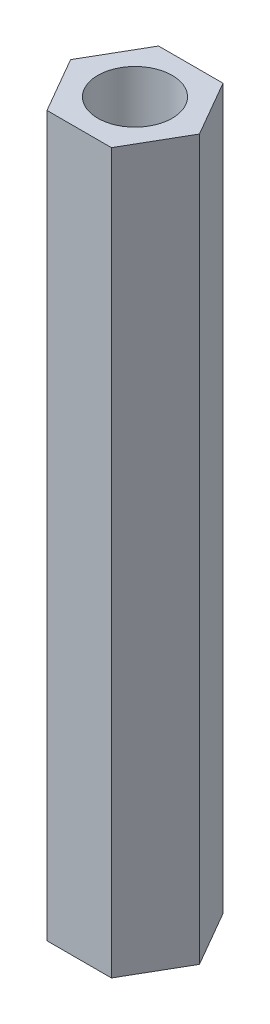
ISO-10303-21;
HEADER;
FILE_DESCRIPTION(('STEP AP214'),'2;1');
FILE_NAME('part.step','',(''),(''),'','','');
FILE_SCHEMA(('AUTOMOTIVE_DESIGN { 1 0 10303 214 1 1 1 1 }'));
ENDSEC;
DATA;
#1=APPLICATION_CONTEXT('core data for automotive mechanical design processes');
#2=APPLICATION_PROTOCOL_DEFINITION('international standard','automotive_design',2000,#1);
#3=PRODUCT_CONTEXT('',#1,'mechanical');
#4=PRODUCT('Part','Part','',(#3));
#5=PRODUCT_RELATED_PRODUCT_CATEGORY('part','',(#4));
#6=PRODUCT_DEFINITION_FORMATION('','',#4);
#7=PRODUCT_DEFINITION_CONTEXT('part definition',#1,'design');
#8=PRODUCT_DEFINITION('design','',#6,#7);
#9=PRODUCT_DEFINITION_SHAPE('','',#8);
#10=(LENGTH_UNIT() NAMED_UNIT(*) SI_UNIT(.MILLI.,.METRE.));
#11=(NAMED_UNIT(*) PLANE_ANGLE_UNIT() SI_UNIT($,.RADIAN.));
#12=(NAMED_UNIT(*) SI_UNIT($,.STERADIAN.) SOLID_ANGLE_UNIT());
#13=UNCERTAINTY_MEASURE_WITH_UNIT(LENGTH_MEASURE(1.E-05),#10,'distance_accuracy_value','');
#14=(GEOMETRIC_REPRESENTATION_CONTEXT(3) GLOBAL_UNCERTAINTY_ASSIGNED_CONTEXT((#13)) GLOBAL_UNIT_ASSIGNED_CONTEXT((#10,
#11,#12)) REPRESENTATION_CONTEXT('',''));
#15=CARTESIAN_POINT('',(0.,0.,0.));
#16=DIRECTION('',(0.,0.,1.));
#17=DIRECTION('',(1.,0.,0.));
#18=AXIS2_PLACEMENT_3D('',#15,#16,#17);
#19=CARTESIAN_POINT('',(0.,58.,0.));
#20=DIRECTION('',(0.,1.,0.));
#21=DIRECTION('',(0.,0.,1.));
#22=AXIS2_PLACEMENT_3D('',#19,#20,#21);
#23=PLANE('',#22);
#24=DIRECTION('',(0.5,0.,-0.866025403784439));
#25=VECTOR('',#24,1.);
#26=CARTESIAN_POINT('',(2.59807621135332,58.,4.5));
#27=LINE('',#26,#25);
#28=CARTESIAN_POINT('',(2.59807621135332,58.,4.5));
#29=VERTEX_POINT('',#28);
#30=CARTESIAN_POINT('',(5.19615242270663,58.,0.));
#31=VERTEX_POINT('',#30);
#32=EDGE_CURVE('E131',#29,#31,#27,.T.);
#33=ORIENTED_EDGE('',*,*,#32,.T.);
#34=DIRECTION('',(-0.5,0.,-0.866025403784439));
#35=VECTOR('',#34,1.);
#36=CARTESIAN_POINT('',(5.19615242270663,58.,0.));
#37=LINE('',#36,#35);
#38=CARTESIAN_POINT('',(2.59807621135331,58.,-4.5));
#39=VERTEX_POINT('',#38);
#40=EDGE_CURVE('E89',#31,#39,#37,.T.);
#41=ORIENTED_EDGE('',*,*,#40,.T.);
#42=DIRECTION('',(-1.,0.,0.));
#43=VECTOR('',#42,1.);
#44=CARTESIAN_POINT('',(2.59807621135331,58.,-4.5));
#45=LINE('',#44,#43);
#46=CARTESIAN_POINT('',(-2.59807621135332,58.,-4.5));
#47=VERTEX_POINT('',#46);
#48=EDGE_CURVE('E102',#39,#47,#45,.T.);
#49=ORIENTED_EDGE('',*,*,#48,.T.);
#50=DIRECTION('',(-0.5,0.,0.866025403784439));
#51=VECTOR('',#50,1.);
#52=CARTESIAN_POINT('',(-2.59807621135332,58.,-4.5));
#53=LINE('',#52,#51);
#54=CARTESIAN_POINT('',(-5.19615242270663,58.,0.));
#55=VERTEX_POINT('',#54);
#56=EDGE_CURVE('E96',#47,#55,#53,.T.);
#57=ORIENTED_EDGE('',*,*,#56,.T.);
#58=DIRECTION('',(0.5,0.,0.866025403784439));
#59=VECTOR('',#58,1.);
#60=CARTESIAN_POINT('',(-5.19615242270663,58.,0.));
#61=LINE('',#60,#59);
#62=CARTESIAN_POINT('',(-2.59807621135332,58.,4.5));
#63=VERTEX_POINT('',#62);
#64=EDGE_CURVE('E100',#55,#63,#61,.T.);
#65=ORIENTED_EDGE('',*,*,#64,.T.);
#66=DIRECTION('',(1.,0.,0.));
#67=VECTOR('',#66,1.);
#68=CARTESIAN_POINT('',(-2.59807621135332,58.,4.5));
#69=LINE('',#68,#67);
#70=EDGE_CURVE('E52',#63,#29,#69,.T.);
#71=ORIENTED_EDGE('',*,*,#70,.T.);
#72=EDGE_LOOP('',(#33,#41,#49,#57,#65,#71));
#73=FACE_BOUND('',#72,.T.);
#74=CARTESIAN_POINT('',(0.,58.,0.));
#75=DIRECTION('',(0.,1.,0.));
#76=DIRECTION('',(0.,0.,1.));
#77=AXIS2_PLACEMENT_3D('',#74,#75,#76);
#78=CIRCLE('',#77,3.);
#79=CARTESIAN_POINT('',(0.,58.,-3.));
#80=VERTEX_POINT('',#79);
#81=EDGE_CURVE('E124',#80,#80,#78,.T.);
#82=ORIENTED_EDGE('',*,*,#81,.F.);
#83=EDGE_LOOP('',(#82));
#84=FACE_BOUND('',#83,.T.);
#85=ADVANCED_FACE('F35',(#73,#84),#23,.T.);
#86=CARTESIAN_POINT('',(0.,0.,0.));
#87=DIRECTION('',(0.,1.,0.));
#88=DIRECTION('',(0.,0.,1.));
#89=AXIS2_PLACEMENT_3D('',#86,#87,#88);
#90=PLANE('',#89);
#91=DIRECTION('',(0.5,0.,-0.866025403784439));
#92=VECTOR('',#91,1.);
#93=CARTESIAN_POINT('',(2.59807621135332,0.,4.5));
#94=LINE('',#93,#92);
#95=CARTESIAN_POINT('',(2.59807621135332,0.,4.5));
#96=VERTEX_POINT('',#95);
#97=CARTESIAN_POINT('',(5.19615242270663,0.,0.));
#98=VERTEX_POINT('',#97);
#99=EDGE_CURVE('E120',#96,#98,#94,.T.);
#100=ORIENTED_EDGE('',*,*,#99,.F.);
#101=DIRECTION('',(1.,0.,0.));
#102=VECTOR('',#101,1.);
#103=CARTESIAN_POINT('',(-2.59807621135332,0.,4.5));
#104=LINE('',#103,#102);
#105=CARTESIAN_POINT('',(-2.59807621135332,0.,4.5));
#106=VERTEX_POINT('',#105);
#107=EDGE_CURVE('E81',#106,#96,#104,.T.);
#108=ORIENTED_EDGE('',*,*,#107,.F.);
#109=DIRECTION('',(0.5,0.,0.866025403784439));
#110=VECTOR('',#109,1.);
#111=CARTESIAN_POINT('',(-5.19615242270663,0.,0.));
#112=LINE('',#111,#110);
#113=CARTESIAN_POINT('',(-5.19615242270663,0.,0.));
#114=VERTEX_POINT('',#113);
#115=EDGE_CURVE('E75',#114,#106,#112,.T.);
#116=ORIENTED_EDGE('',*,*,#115,.F.);
#117=DIRECTION('',(-0.5,0.,0.866025403784439));
#118=VECTOR('',#117,1.);
#119=CARTESIAN_POINT('',(-2.59807621135332,0.,-4.5));
#120=LINE('',#119,#118);
#121=CARTESIAN_POINT('',(-2.59807621135332,0.,-4.5));
#122=VERTEX_POINT('',#121);
#123=EDGE_CURVE('E110',#122,#114,#120,.T.);
#124=ORIENTED_EDGE('',*,*,#123,.F.);
#125=DIRECTION('',(-1.,0.,0.));
#126=VECTOR('',#125,1.);
#127=CARTESIAN_POINT('',(2.59807621135331,0.,-4.5));
#128=LINE('',#127,#126);
#129=CARTESIAN_POINT('',(2.59807621135331,0.,-4.5));
#130=VERTEX_POINT('',#129);
#131=EDGE_CURVE('E126',#130,#122,#128,.T.);
#132=ORIENTED_EDGE('',*,*,#131,.F.);
#133=DIRECTION('',(-0.5,0.,-0.866025403784439));
#134=VECTOR('',#133,1.);
#135=CARTESIAN_POINT('',(5.19615242270663,0.,0.));
#136=LINE('',#135,#134);
#137=EDGE_CURVE('E123',#98,#130,#136,.T.);
#138=ORIENTED_EDGE('',*,*,#137,.F.);
#139=EDGE_LOOP('',(#100,#108,#116,#124,#132,#138));
#140=FACE_BOUND('',#139,.T.);
#141=CARTESIAN_POINT('',(0.,0.,0.));
#142=DIRECTION('',(0.,1.,0.));
#143=DIRECTION('',(0.,0.,1.));
#144=AXIS2_PLACEMENT_3D('',#141,#142,#143);
#145=CIRCLE('',#144,3.);
#146=CARTESIAN_POINT('',(0.,0.,-3.));
#147=VERTEX_POINT('',#146);
#148=EDGE_CURVE('E224',#147,#147,#145,.T.);
#149=ORIENTED_EDGE('',*,*,#148,.T.);
#150=EDGE_LOOP('',(#149));
#151=FACE_BOUND('',#150,.T.);
#152=ADVANCED_FACE('F140',(#140,#151),#90,.F.);
#153=CARTESIAN_POINT('',(2.59807621135332,58.,4.5));
#154=DIRECTION('',(-0.866025403784439,0.,-0.5));
#155=DIRECTION('',(-0.5,0.,0.866025403784439));
#156=AXIS2_PLACEMENT_3D('',#153,#154,#155);
#157=PLANE('',#156);
#158=ORIENTED_EDGE('',*,*,#99,.T.);
#159=DIRECTION('',(0.,-1.,0.));
#160=VECTOR('',#159,1.);
#161=CARTESIAN_POINT('',(5.19615242270663,58.,0.));
#162=LINE('',#161,#160);
#163=EDGE_CURVE('E11',#31,#98,#162,.T.);
#164=ORIENTED_EDGE('',*,*,#163,.F.);
#165=ORIENTED_EDGE('',*,*,#32,.F.);
#166=DIRECTION('',(0.,-1.,0.));
#167=VECTOR('',#166,1.);
#168=CARTESIAN_POINT('',(2.59807621135332,58.,4.5));
#169=LINE('',#168,#167);
#170=EDGE_CURVE('E116',#29,#96,#169,.T.);
#171=ORIENTED_EDGE('',*,*,#170,.T.);
#172=EDGE_LOOP('',(#158,#164,#165,#171));
#173=FACE_BOUND('',#172,.T.);
#174=ADVANCED_FACE('F37',(#173),#157,.F.);
#175=CARTESIAN_POINT('',(5.19615242270663,58.,0.));
#176=DIRECTION('',(-0.866025403784438,0.,0.5));
#177=DIRECTION('',(0.5,0.,0.866025403784439));
#178=AXIS2_PLACEMENT_3D('',#175,#176,#177);
#179=PLANE('',#178);
#180=ORIENTED_EDGE('',*,*,#137,.T.);
#181=DIRECTION('',(0.,-1.,0.));
#182=VECTOR('',#181,1.);
#183=CARTESIAN_POINT('',(2.59807621135331,58.,-4.5));
#184=LINE('',#183,#182);
#185=EDGE_CURVE('E44',#39,#130,#184,.T.);
#186=ORIENTED_EDGE('',*,*,#185,.F.);
#187=ORIENTED_EDGE('',*,*,#40,.F.);
#188=ORIENTED_EDGE('',*,*,#163,.T.);
#189=EDGE_LOOP('',(#180,#186,#187,#188));
#190=FACE_BOUND('',#189,.T.);
#191=ADVANCED_FACE('F165',(#190),#179,.F.);
#192=CARTESIAN_POINT('',(2.59807621135331,58.,-4.5));
#193=DIRECTION('',(0.,0.,1.));
#194=DIRECTION('',(1.,0.,0.));
#195=AXIS2_PLACEMENT_3D('',#192,#193,#194);
#196=PLANE('',#195);
#197=ORIENTED_EDGE('',*,*,#131,.T.);
#198=DIRECTION('',(0.,-1.,0.));
#199=VECTOR('',#198,1.);
#200=CARTESIAN_POINT('',(-2.59807621135332,58.,-4.5));
#201=LINE('',#200,#199);
#202=EDGE_CURVE('E111',#47,#122,#201,.T.);
#203=ORIENTED_EDGE('',*,*,#202,.F.);
#204=ORIENTED_EDGE('',*,*,#48,.F.);
#205=ORIENTED_EDGE('',*,*,#185,.T.);
#206=EDGE_LOOP('',(#197,#203,#204,#205));
#207=FACE_BOUND('',#206,.T.);
#208=ADVANCED_FACE('F137',(#207),#196,.F.);
#209=CARTESIAN_POINT('',(-2.59807621135332,58.,-4.5));
#210=DIRECTION('',(0.866025403784439,0.,0.5));
#211=DIRECTION('',(0.5,0.,-0.866025403784439));
#212=AXIS2_PLACEMENT_3D('',#209,#210,#211);
#213=PLANE('',#212);
#214=ORIENTED_EDGE('',*,*,#123,.T.);
#215=DIRECTION('',(0.,-1.,0.));
#216=VECTOR('',#215,1.);
#217=CARTESIAN_POINT('',(-5.19615242270663,58.,0.));
#218=LINE('',#217,#216);
#219=EDGE_CURVE('E107',#55,#114,#218,.T.);
#220=ORIENTED_EDGE('',*,*,#219,.F.);
#221=ORIENTED_EDGE('',*,*,#56,.F.);
#222=ORIENTED_EDGE('',*,*,#202,.T.);
#223=EDGE_LOOP('',(#214,#220,#221,#222));
#224=FACE_BOUND('',#223,.T.);
#225=ADVANCED_FACE('F108',(#224),#213,.F.);
#226=CARTESIAN_POINT('',(-5.19615242270663,58.,0.));
#227=DIRECTION('',(0.866025403784438,0.,-0.5));
#228=DIRECTION('',(-0.5,0.,-0.866025403784439));
#229=AXIS2_PLACEMENT_3D('',#226,#227,#228);
#230=PLANE('',#229);
#231=ORIENTED_EDGE('',*,*,#115,.T.);
#232=DIRECTION('',(0.,-1.,0.));
#233=VECTOR('',#232,1.);
#234=CARTESIAN_POINT('',(-2.59807621135332,58.,4.5));
#235=LINE('',#234,#233);
#236=EDGE_CURVE('E112',#63,#106,#235,.T.);
#237=ORIENTED_EDGE('',*,*,#236,.F.);
#238=ORIENTED_EDGE('',*,*,#64,.F.);
#239=ORIENTED_EDGE('',*,*,#219,.T.);
#240=EDGE_LOOP('',(#231,#237,#238,#239));
#241=FACE_BOUND('',#240,.T.);
#242=ADVANCED_FACE('F114',(#241),#230,.F.);
#243=CARTESIAN_POINT('',(-2.59807621135332,58.,4.5));
#244=DIRECTION('',(0.,0.,-1.));
#245=DIRECTION('',(-1.,0.,0.));
#246=AXIS2_PLACEMENT_3D('',#243,#244,#245);
#247=PLANE('',#246);
#248=ORIENTED_EDGE('',*,*,#107,.T.);
#249=ORIENTED_EDGE('',*,*,#170,.F.);
#250=ORIENTED_EDGE('',*,*,#70,.F.);
#251=ORIENTED_EDGE('',*,*,#236,.T.);
#252=EDGE_LOOP('',(#248,#249,#250,#251));
#253=FACE_BOUND('',#252,.T.);
#254=ADVANCED_FACE('F145',(#253),#247,.F.);
#255=CARTESIAN_POINT('',(0.,58.,0.));
#256=DIRECTION('',(0.,-1.,0.));
#257=DIRECTION('',(0.,0.,-1.));
#258=AXIS2_PLACEMENT_3D('',#255,#256,#257);
#259=CYLINDRICAL_SURFACE('',#258,3.);
#260=CARTESIAN_POINT('',(0.,58.,-3.));
#261=CARTESIAN_POINT('',(0.,57.3958333333333,-3.));
#262=CARTESIAN_POINT('',(0.,56.7916666666667,-3.));
#263=CARTESIAN_POINT('',(0.,55.5833333333333,-3.));
#264=CARTESIAN_POINT('',(0.,54.9791666666667,-3.));
#265=CARTESIAN_POINT('',(0.,53.7708333333333,-3.));
#266=CARTESIAN_POINT('',(0.,53.1666666666667,-3.));
#267=CARTESIAN_POINT('',(0.,51.9583333333333,-3.));
#268=CARTESIAN_POINT('',(0.,51.3541666666667,-3.));
#269=CARTESIAN_POINT('',(0.,50.1458333333333,-3.));
#270=CARTESIAN_POINT('',(0.,49.5416666666667,-3.));
#271=CARTESIAN_POINT('',(0.,48.3333333333333,-3.));
#272=CARTESIAN_POINT('',(0.,47.7291666666667,-3.));
#273=CARTESIAN_POINT('',(0.,46.5208333333333,-3.));
#274=CARTESIAN_POINT('',(0.,45.9166666666667,-3.));
#275=CARTESIAN_POINT('',(0.,44.7083333333333,-3.));
#276=CARTESIAN_POINT('',(0.,44.1041666666667,-3.));
#277=CARTESIAN_POINT('',(0.,42.8958333333333,-3.));
#278=CARTESIAN_POINT('',(0.,42.2916666666667,-3.));
#279=CARTESIAN_POINT('',(0.,41.0833333333333,-3.));
#280=CARTESIAN_POINT('',(0.,40.4791666666667,-3.));
#281=CARTESIAN_POINT('',(0.,39.2708333333333,-3.));
#282=CARTESIAN_POINT('',(0.,38.6666666666667,-3.));
#283=CARTESIAN_POINT('',(0.,37.4583333333333,-3.));
#284=CARTESIAN_POINT('',(0.,36.8541666666667,-3.));
#285=CARTESIAN_POINT('',(0.,35.6458333333333,-3.));
#286=CARTESIAN_POINT('',(0.,35.0416666666667,-3.));
#287=CARTESIAN_POINT('',(0.,33.8333333333333,-3.));
#288=CARTESIAN_POINT('',(0.,33.2291666666667,-3.));
#289=CARTESIAN_POINT('',(0.,32.0208333333333,-3.));
#290=CARTESIAN_POINT('',(0.,31.4166666666667,-3.));
#291=CARTESIAN_POINT('',(0.,30.2083333333333,-3.));
#292=CARTESIAN_POINT('',(0.,29.6041666666667,-3.));
#293=CARTESIAN_POINT('',(0.,28.3958333333333,-3.));
#294=CARTESIAN_POINT('',(0.,27.7916666666667,-3.));
#295=CARTESIAN_POINT('',(0.,26.5833333333333,-3.));
#296=CARTESIAN_POINT('',(0.,25.9791666666667,-3.));
#297=CARTESIAN_POINT('',(0.,24.7708333333333,-3.));
#298=CARTESIAN_POINT('',(0.,24.1666666666667,-3.));
#299=CARTESIAN_POINT('',(0.,22.9583333333333,-3.));
#300=CARTESIAN_POINT('',(0.,22.3541666666667,-3.));
#301=CARTESIAN_POINT('',(0.,21.1458333333333,-3.));
#302=CARTESIAN_POINT('',(0.,20.5416666666667,-3.));
#303=CARTESIAN_POINT('',(0.,19.3333333333333,-3.));
#304=CARTESIAN_POINT('',(0.,18.7291666666667,-3.));
#305=CARTESIAN_POINT('',(0.,17.5208333333333,-3.));
#306=CARTESIAN_POINT('',(0.,16.9166666666667,-3.));
#307=CARTESIAN_POINT('',(0.,15.7083333333333,-3.));
#308=CARTESIAN_POINT('',(0.,15.1041666666667,-3.));
#309=CARTESIAN_POINT('',(0.,13.8958333333333,-3.));
#310=CARTESIAN_POINT('',(0.,13.2916666666667,-3.));
#311=CARTESIAN_POINT('',(0.,12.0833333333333,-3.));
#312=CARTESIAN_POINT('',(0.,11.4791666666667,-3.));
#313=CARTESIAN_POINT('',(0.,10.2708333333333,-3.));
#314=CARTESIAN_POINT('',(0.,9.66666666666667,-3.));
#315=CARTESIAN_POINT('',(0.,8.45833333333333,-3.));
#316=CARTESIAN_POINT('',(0.,7.85416666666667,-3.));
#317=CARTESIAN_POINT('',(0.,6.64583333333333,-3.));
#318=CARTESIAN_POINT('',(0.,6.04166666666667,-3.));
#319=CARTESIAN_POINT('',(0.,4.83333333333333,-3.));
#320=CARTESIAN_POINT('',(0.,4.22916666666667,-3.));
#321=CARTESIAN_POINT('',(0.,3.02083333333334,-3.));
#322=CARTESIAN_POINT('',(0.,2.41666666666667,-3.));
#323=CARTESIAN_POINT('',(0.,1.20833333333333,-3.));
#324=CARTESIAN_POINT('',(0.,0.604166666666666,-3.));
#325=CARTESIAN_POINT('',(0.,0.,-3.));
#326=B_SPLINE_CURVE_WITH_KNOTS('',3,(#260,#261,#262,#263,#264,#265,#266,#267,#268,#269,#270,
#271,#272,#273,#274,#275,#276,#277,#278,#279,#280,#281,#282,#283,#284,#285,#286,#287,#288,#289,
#290,#291,#292,#293,#294,#295,#296,#297,#298,#299,#300,#301,#302,#303,#304,#305,#306,#307,#308,
#309,#310,#311,#312,#313,#314,#315,#316,#317,#318,#319,#320,#321,#322,#323,#324,#325),
.UNSPECIFIED.,.F.,.F.,(4,2,2,2,2,2,2,2,2,2,2,2,2,2,2,2,2,2,2,2,2,2,2,2,2,2,2,2,2,2,2,2,4),(0.,
1.8125,3.625,5.4375,7.25000000000001,9.0625,10.875,12.6875,14.5,16.3125,18.125,19.9375,21.75,
23.5625,25.375,27.1875,29.,30.8125,32.625,34.4375,36.25,38.0625,39.875,41.6875,43.5,45.3125,
47.125,48.9375,50.75,52.5625,54.375,56.1875,58.),.UNSPECIFIED.);
#327=EDGE_CURVE('BSEAM147',#80,#147,#326,.T.);
#328=ORIENTED_EDGE('',*,*,#81,.T.);
#329=ORIENTED_EDGE('',*,*,#148,.F.);
#330=ORIENTED_EDGE('',*,*,#327,.T.);
#331=ORIENTED_EDGE('',*,*,#327,.F.);
#332=EDGE_LOOP('',(#328,#330,#329,#331));
#333=FACE_BOUND('',#332,.T.);
#334=ADVANCED_FACE('F147',(#333),#259,.F.);
#335=CLOSED_SHELL('',(#85,#152,#174,#191,#208,#225,#242,#254,#334));
#336=MANIFOLD_SOLID_BREP('B2',#335);
#337=ADVANCED_BREP_SHAPE_REPRESENTATION('',(#18,#336),#14);
#338=SHAPE_DEFINITION_REPRESENTATION(#9,#337);
ENDSEC;
END-ISO-10303-21;
